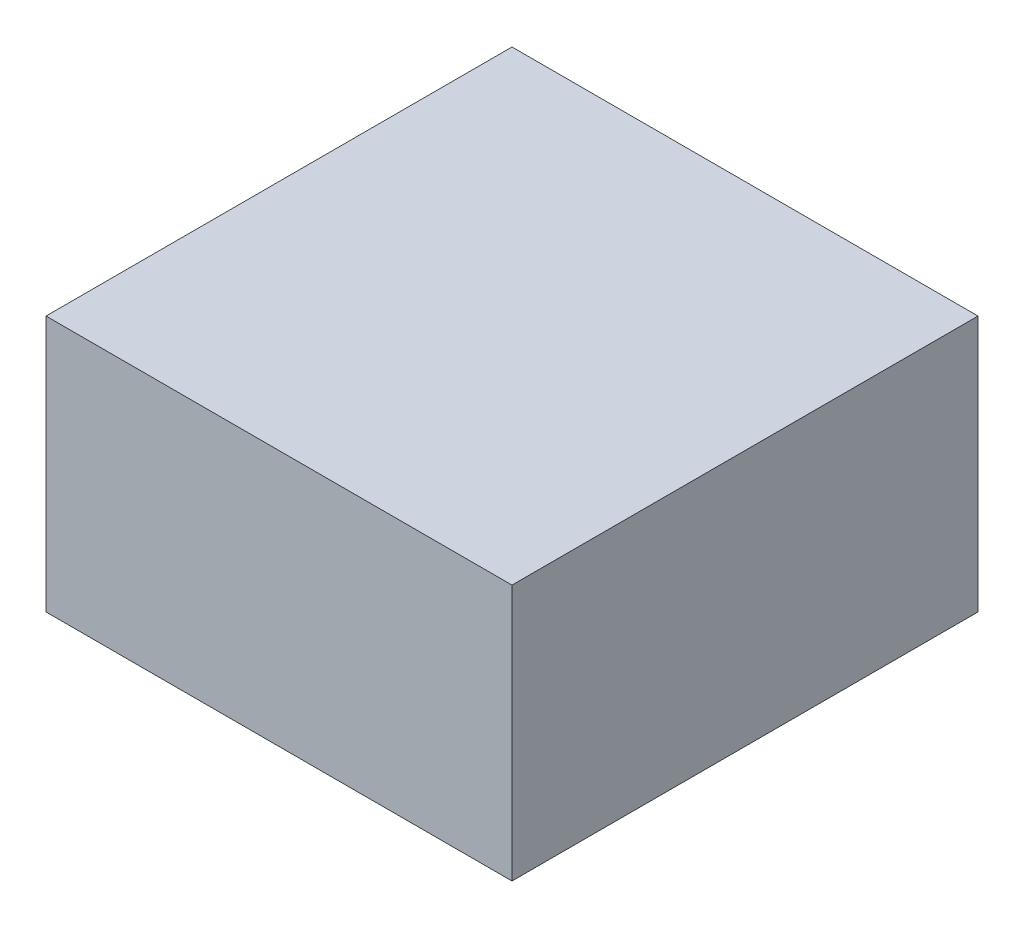
ISO-10303-21;
HEADER;
FILE_DESCRIPTION(('STEP AP214'),'2;1');
FILE_NAME('part.step','',(''),(''),'','','');
FILE_SCHEMA(('AUTOMOTIVE_DESIGN { 1 0 10303 214 1 1 1 1 }'));
ENDSEC;
DATA;
#1=APPLICATION_CONTEXT('core data for automotive mechanical design processes');
#2=APPLICATION_PROTOCOL_DEFINITION('international standard','automotive_design',2000,#1);
#3=PRODUCT_CONTEXT('',#1,'mechanical');
#4=PRODUCT('Part','Part','',(#3));
#5=PRODUCT_RELATED_PRODUCT_CATEGORY('part','',(#4));
#6=PRODUCT_DEFINITION_FORMATION('','',#4);
#7=PRODUCT_DEFINITION_CONTEXT('part definition',#1,'design');
#8=PRODUCT_DEFINITION('design','',#6,#7);
#9=PRODUCT_DEFINITION_SHAPE('','',#8);
#10=(LENGTH_UNIT() NAMED_UNIT(*) SI_UNIT(.MILLI.,.METRE.));
#11=(NAMED_UNIT(*) PLANE_ANGLE_UNIT() SI_UNIT($,.RADIAN.));
#12=(NAMED_UNIT(*) SI_UNIT($,.STERADIAN.) SOLID_ANGLE_UNIT());
#13=UNCERTAINTY_MEASURE_WITH_UNIT(LENGTH_MEASURE(1.E-05),#10,'distance_accuracy_value','');
#14=(GEOMETRIC_REPRESENTATION_CONTEXT(3) GLOBAL_UNCERTAINTY_ASSIGNED_CONTEXT((#13)) GLOBAL_UNIT_ASSIGNED_CONTEXT((#10,
#11,#12)) REPRESENTATION_CONTEXT('',''));
#15=CARTESIAN_POINT('',(0.,0.,0.));
#16=DIRECTION('',(0.,0.,1.));
#17=DIRECTION('',(1.,0.,0.));
#18=AXIS2_PLACEMENT_3D('',#15,#16,#17);
#19=CARTESIAN_POINT('',(5.,5.5,-5.));
#20=DIRECTION('',(-1.,0.,0.));
#21=DIRECTION('',(0.,0.,1.));
#22=AXIS2_PLACEMENT_3D('',#19,#20,#21);
#23=PLANE('',#22);
#24=DIRECTION('',(0.,0.,-1.));
#25=VECTOR('',#24,1.);
#26=CARTESIAN_POINT('',(5.,0.,-5.));
#27=LINE('',#26,#25);
#28=CARTESIAN_POINT('',(5.,0.,5.));
#29=VERTEX_POINT('',#28);
#30=CARTESIAN_POINT('',(5.,0.,-5.));
#31=VERTEX_POINT('',#30);
#32=EDGE_CURVE('E96',#29,#31,#27,.T.);
#33=ORIENTED_EDGE('',*,*,#32,.T.);
#34=DIRECTION('',(0.,-1.,0.));
#35=VECTOR('',#34,1.);
#36=CARTESIAN_POINT('',(5.,5.5,-5.));
#37=LINE('',#36,#35);
#38=CARTESIAN_POINT('',(5.,5.5,-5.));
#39=VERTEX_POINT('',#38);
#40=EDGE_CURVE('E11',#39,#31,#37,.T.);
#41=ORIENTED_EDGE('',*,*,#40,.F.);
#42=DIRECTION('',(0.,0.,-1.));
#43=VECTOR('',#42,1.);
#44=CARTESIAN_POINT('',(5.,5.5,-5.));
#45=LINE('',#44,#43);
#46=CARTESIAN_POINT('',(5.,5.5,5.));
#47=VERTEX_POINT('',#46);
#48=EDGE_CURVE('E84',#47,#39,#45,.T.);
#49=ORIENTED_EDGE('',*,*,#48,.F.);
#50=DIRECTION('',(0.,-1.,0.));
#51=VECTOR('',#50,1.);
#52=CARTESIAN_POINT('',(5.,5.5,5.));
#53=LINE('',#52,#51);
#54=EDGE_CURVE('E92',#47,#29,#53,.T.);
#55=ORIENTED_EDGE('',*,*,#54,.T.);
#56=EDGE_LOOP('',(#33,#41,#49,#55));
#57=FACE_BOUND('',#56,.T.);
#58=ADVANCED_FACE('F33',(#57),#23,.F.);
#59=CARTESIAN_POINT('',(-5.,5.5,-5.));
#60=DIRECTION('',(0.,0.,1.));
#61=DIRECTION('',(1.,0.,0.));
#62=AXIS2_PLACEMENT_3D('',#59,#60,#61);
#63=PLANE('',#62);
#64=DIRECTION('',(-1.,0.,0.));
#65=VECTOR('',#64,1.);
#66=CARTESIAN_POINT('',(-5.,0.,-5.));
#67=LINE('',#66,#65);
#68=CARTESIAN_POINT('',(-5.,0.,-5.));
#69=VERTEX_POINT('',#68);
#70=EDGE_CURVE('E88',#31,#69,#67,.T.);
#71=ORIENTED_EDGE('',*,*,#70,.T.);
#72=DIRECTION('',(0.,-1.,0.));
#73=VECTOR('',#72,1.);
#74=CARTESIAN_POINT('',(-5.,5.5,-5.));
#75=LINE('',#74,#73);
#76=CARTESIAN_POINT('',(-5.,5.5,-5.));
#77=VERTEX_POINT('',#76);
#78=EDGE_CURVE('E41',#77,#69,#75,.T.);
#79=ORIENTED_EDGE('',*,*,#78,.F.);
#80=DIRECTION('',(-1.,0.,0.));
#81=VECTOR('',#80,1.);
#82=CARTESIAN_POINT('',(-5.,5.5,-5.));
#83=LINE('',#82,#81);
#84=EDGE_CURVE('E79',#39,#77,#83,.T.);
#85=ORIENTED_EDGE('',*,*,#84,.F.);
#86=ORIENTED_EDGE('',*,*,#40,.T.);
#87=EDGE_LOOP('',(#71,#79,#85,#86));
#88=FACE_BOUND('',#87,.T.);
#89=ADVANCED_FACE('F87',(#88),#63,.F.);
#90=CARTESIAN_POINT('',(-5.,5.5,-5.));
#91=DIRECTION('',(1.,0.,0.));
#92=DIRECTION('',(0.,0.,-1.));
#93=AXIS2_PLACEMENT_3D('',#90,#91,#92);
#94=PLANE('',#93);
#95=DIRECTION('',(0.,0.,1.));
#96=VECTOR('',#95,1.);
#97=CARTESIAN_POINT('',(-5.,0.,-5.));
#98=LINE('',#97,#96);
#99=CARTESIAN_POINT('',(-5.,0.,5.));
#100=VERTEX_POINT('',#99);
#101=EDGE_CURVE('E66',#69,#100,#98,.T.);
#102=ORIENTED_EDGE('',*,*,#101,.T.);
#103=DIRECTION('',(0.,-1.,0.));
#104=VECTOR('',#103,1.);
#105=CARTESIAN_POINT('',(-5.,5.5,5.));
#106=LINE('',#105,#104);
#107=CARTESIAN_POINT('',(-5.,5.5,5.));
#108=VERTEX_POINT('',#107);
#109=EDGE_CURVE('E89',#108,#100,#106,.T.);
#110=ORIENTED_EDGE('',*,*,#109,.F.);
#111=DIRECTION('',(0.,0.,1.));
#112=VECTOR('',#111,1.);
#113=CARTESIAN_POINT('',(-5.,5.5,-5.));
#114=LINE('',#113,#112);
#115=EDGE_CURVE('E82',#77,#108,#114,.T.);
#116=ORIENTED_EDGE('',*,*,#115,.F.);
#117=ORIENTED_EDGE('',*,*,#78,.T.);
#118=EDGE_LOOP('',(#102,#110,#116,#117));
#119=FACE_BOUND('',#118,.T.);
#120=ADVANCED_FACE('F90',(#119),#94,.F.);
#121=CARTESIAN_POINT('',(-5.,5.5,5.));
#122=DIRECTION('',(0.,0.,-1.));
#123=DIRECTION('',(-1.,0.,0.));
#124=AXIS2_PLACEMENT_3D('',#121,#122,#123);
#125=PLANE('',#124);
#126=DIRECTION('',(1.,0.,0.));
#127=VECTOR('',#126,1.);
#128=CARTESIAN_POINT('',(-5.,0.,5.));
#129=LINE('',#128,#127);
#130=EDGE_CURVE('E72',#100,#29,#129,.T.);
#131=ORIENTED_EDGE('',*,*,#130,.T.);
#132=ORIENTED_EDGE('',*,*,#54,.F.);
#133=DIRECTION('',(1.,0.,0.));
#134=VECTOR('',#133,1.);
#135=CARTESIAN_POINT('',(-5.,5.5,5.));
#136=LINE('',#135,#134);
#137=EDGE_CURVE('E49',#108,#47,#136,.T.);
#138=ORIENTED_EDGE('',*,*,#137,.F.);
#139=ORIENTED_EDGE('',*,*,#109,.T.);
#140=EDGE_LOOP('',(#131,#132,#138,#139));
#141=FACE_BOUND('',#140,.T.);
#142=ADVANCED_FACE('F103',(#141),#125,.F.);
#143=CARTESIAN_POINT('',(0.,5.5,0.));
#144=DIRECTION('',(0.,1.,0.));
#145=DIRECTION('',(0.,0.,1.));
#146=AXIS2_PLACEMENT_3D('',#143,#144,#145);
#147=PLANE('',#146);
#148=ORIENTED_EDGE('',*,*,#48,.T.);
#149=ORIENTED_EDGE('',*,*,#84,.T.);
#150=ORIENTED_EDGE('',*,*,#115,.T.);
#151=ORIENTED_EDGE('',*,*,#137,.T.);
#152=EDGE_LOOP('',(#148,#149,#150,#151));
#153=FACE_BOUND('',#152,.T.);
#154=ADVANCED_FACE('F80',(#153),#147,.T.);
#155=CARTESIAN_POINT('',(0.,0.,0.));
#156=DIRECTION('',(0.,1.,0.));
#157=DIRECTION('',(0.,0.,1.));
#158=AXIS2_PLACEMENT_3D('',#155,#156,#157);
#159=PLANE('',#158);
#160=ORIENTED_EDGE('',*,*,#32,.F.);
#161=ORIENTED_EDGE('',*,*,#130,.F.);
#162=ORIENTED_EDGE('',*,*,#101,.F.);
#163=ORIENTED_EDGE('',*,*,#70,.F.);
#164=EDGE_LOOP('',(#160,#161,#162,#163));
#165=FACE_BOUND('',#164,.T.);
#166=ADVANCED_FACE('F106',(#165),#159,.F.);
#167=CLOSED_SHELL('',(#58,#89,#120,#142,#154,#166));
#168=MANIFOLD_SOLID_BREP('B2',#167);
#169=ADVANCED_BREP_SHAPE_REPRESENTATION('',(#18,#168),#14);
#170=SHAPE_DEFINITION_REPRESENTATION(#9,#169);
ENDSEC;
END-ISO-10303-21;
